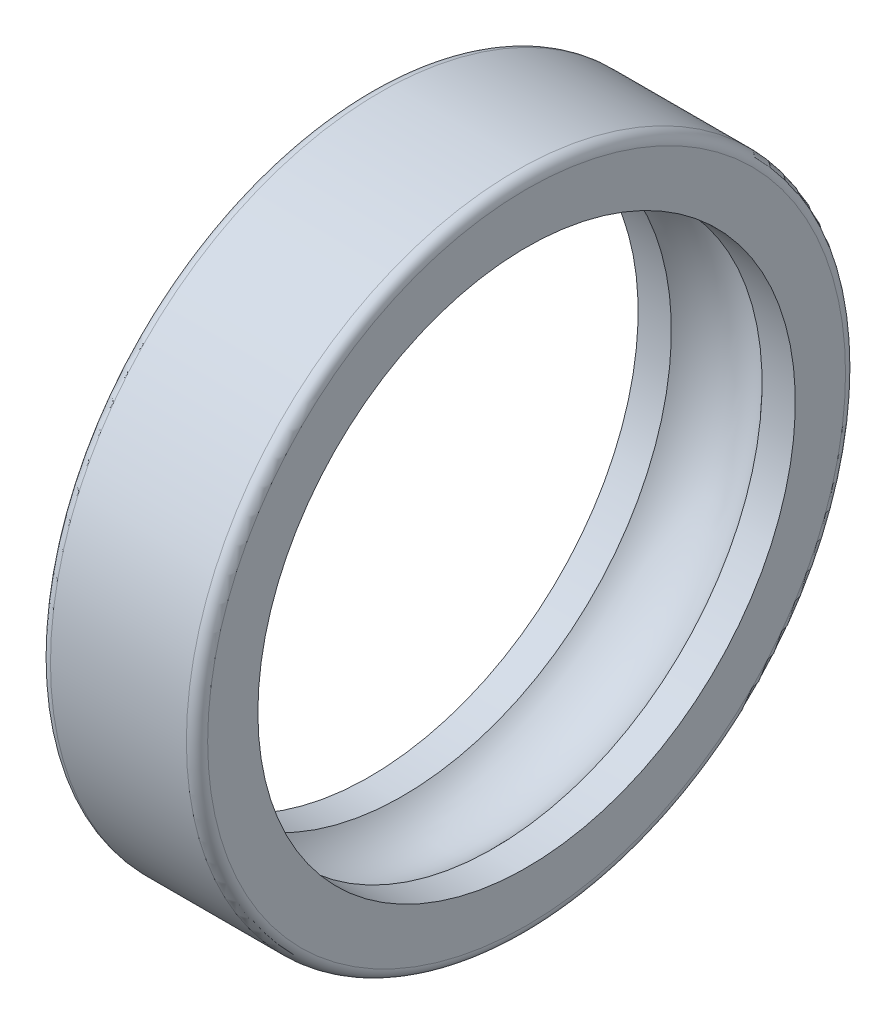
ISO-10303-21;
HEADER;
FILE_DESCRIPTION(('STEP AP214'),'2;1');
FILE_NAME('part.step','',(''),(''),'','','');
FILE_SCHEMA(('AUTOMOTIVE_DESIGN { 1 0 10303 214 1 1 1 1 }'));
ENDSEC;
DATA;
#1=APPLICATION_CONTEXT('core data for automotive mechanical design processes');
#2=APPLICATION_PROTOCOL_DEFINITION('international standard','automotive_design',2000,#1);
#3=PRODUCT_CONTEXT('',#1,'mechanical');
#4=PRODUCT('Part','Part','',(#3));
#5=PRODUCT_RELATED_PRODUCT_CATEGORY('part','',(#4));
#6=PRODUCT_DEFINITION_FORMATION('','',#4);
#7=PRODUCT_DEFINITION_CONTEXT('part definition',#1,'design');
#8=PRODUCT_DEFINITION('design','',#6,#7);
#9=PRODUCT_DEFINITION_SHAPE('','',#8);
#10=(LENGTH_UNIT() NAMED_UNIT(*) SI_UNIT(.MILLI.,.METRE.));
#11=(NAMED_UNIT(*) PLANE_ANGLE_UNIT() SI_UNIT($,.RADIAN.));
#12=(NAMED_UNIT(*) SI_UNIT($,.STERADIAN.) SOLID_ANGLE_UNIT());
#13=UNCERTAINTY_MEASURE_WITH_UNIT(LENGTH_MEASURE(1.E-05),#10,'distance_accuracy_value','');
#14=(GEOMETRIC_REPRESENTATION_CONTEXT(3) GLOBAL_UNCERTAINTY_ASSIGNED_CONTEXT((#13)) GLOBAL_UNIT_ASSIGNED_CONTEXT((#10,
#11,#12)) REPRESENTATION_CONTEXT('',''));
#15=CARTESIAN_POINT('',(0.,0.,0.));
#16=DIRECTION('',(0.,0.,1.));
#17=DIRECTION('',(1.,0.,0.));
#18=AXIS2_PLACEMENT_3D('',#15,#16,#17);
#19=CARTESIAN_POINT('',(-8.87545902678571,0.,0.));
#20=DIRECTION('',(-1.,0.,0.));
#21=DIRECTION('',(0.,0.,1.));
#22=AXIS2_PLACEMENT_3D('',#19,#20,#21);
#23=CYLINDRICAL_SURFACE('',#22,18.55);
#24=CARTESIAN_POINT('',(5.425,0.,0.));
#25=DIRECTION('',(-1.,0.,0.));
#26=DIRECTION('',(0.,0.,1.));
#27=AXIS2_PLACEMENT_3D('',#24,#25,#26);
#28=CIRCLE('',#27,18.55);
#29=CARTESIAN_POINT('',(5.425,0.,18.55));
#30=VERTEX_POINT('',#29);
#31=EDGE_CURVE('E64',#30,#30,#28,.T.);
#32=ORIENTED_EDGE('',*,*,#31,.F.);
#33=EDGE_LOOP('',(#32));
#34=FACE_BOUND('',#33,.T.);
#35=CARTESIAN_POINT('',(3.13049516849971,0.,0.));
#36=DIRECTION('',(-1.,0.,0.));
#37=DIRECTION('',(0.,0.,1.));
#38=AXIS2_PLACEMENT_3D('',#35,#36,#37);
#39=CIRCLE('',#38,18.55);
#40=CARTESIAN_POINT('',(3.13049516849971,0.,18.55));
#41=VERTEX_POINT('',#40);
#42=EDGE_CURVE('E55',#41,#41,#39,.T.);
#43=ORIENTED_EDGE('',*,*,#42,.T.);
#44=EDGE_LOOP('',(#43));
#45=FACE_BOUND('',#44,.T.);
#46=ADVANCED_FACE('F35',(#34,#45),#23,.F.);
#47=CARTESIAN_POINT('',(0.,0.,0.));
#48=DIRECTION('',(-1.,0.,0.));
#49=DIRECTION('',(0.,0.,1.));
#50=AXIS2_PLACEMENT_3D('',#47,#48,#49);
#51=TOROIDAL_SURFACE('',#50,15.75,4.2);
#52=ORIENTED_EDGE('',*,*,#42,.F.);
#53=EDGE_LOOP('',(#52));
#54=FACE_BOUND('',#53,.T.);
#55=CARTESIAN_POINT('',(-3.13049516849971,0.,0.));
#56=DIRECTION('',(-1.,0.,0.));
#57=DIRECTION('',(0.,0.,1.));
#58=AXIS2_PLACEMENT_3D('',#55,#56,#57);
#59=CIRCLE('',#58,18.55);
#60=CARTESIAN_POINT('',(-3.13049516849971,0.,18.55));
#61=VERTEX_POINT('',#60);
#62=EDGE_CURVE('E58',#61,#61,#59,.T.);
#63=ORIENTED_EDGE('',*,*,#62,.T.);
#64=EDGE_LOOP('',(#63));
#65=FACE_BOUND('',#64,.T.);
#66=ADVANCED_FACE('F72',(#54,#65),#51,.F.);
#67=CARTESIAN_POINT('',(-8.87545902678571,0.,0.));
#68=DIRECTION('',(-1.,0.,0.));
#69=DIRECTION('',(0.,0.,1.));
#70=AXIS2_PLACEMENT_3D('',#67,#68,#69);
#71=CYLINDRICAL_SURFACE('',#70,18.55);
#72=ORIENTED_EDGE('',*,*,#62,.F.);
#73=EDGE_LOOP('',(#72));
#74=FACE_BOUND('',#73,.T.);
#75=CARTESIAN_POINT('',(-5.425,0.,0.));
#76=DIRECTION('',(-1.,0.,0.));
#77=DIRECTION('',(0.,0.,1.));
#78=AXIS2_PLACEMENT_3D('',#75,#76,#77);
#79=CIRCLE('',#78,18.55);
#80=CARTESIAN_POINT('',(-5.425,0.,18.55));
#81=VERTEX_POINT('',#80);
#82=EDGE_CURVE('E61',#81,#81,#79,.T.);
#83=ORIENTED_EDGE('',*,*,#82,.T.);
#84=EDGE_LOOP('',(#83));
#85=FACE_BOUND('',#84,.T.);
#86=ADVANCED_FACE('F78',(#74,#85),#71,.F.);
#87=CARTESIAN_POINT('',(-5.425,22.75,0.));
#88=DIRECTION('',(1.,0.,0.));
#89=DIRECTION('',(0.,0.,-1.));
#90=AXIS2_PLACEMENT_3D('',#87,#88,#89);
#91=PLANE('',#90);
#92=CARTESIAN_POINT('',(-5.425,0.,0.));
#93=DIRECTION('',(1.,0.,0.));
#94=DIRECTION('',(0.,0.,-1.));
#95=AXIS2_PLACEMENT_3D('',#92,#93,#94);
#96=CIRCLE('',#95,22.015);
#97=CARTESIAN_POINT('',(-5.425,0.,-22.015));
#98=VERTEX_POINT('',#97);
#99=EDGE_CURVE('E10',#98,#98,#96,.F.);
#100=ORIENTED_EDGE('',*,*,#99,.T.);
#101=EDGE_LOOP('',(#100));
#102=FACE_BOUND('',#101,.T.);
#103=ORIENTED_EDGE('',*,*,#82,.F.);
#104=EDGE_LOOP('',(#103));
#105=FACE_BOUND('',#104,.T.);
#106=ADVANCED_FACE('F84',(#102,#105),#91,.F.);
#107=CARTESIAN_POINT('',(-8.87545902678571,0.,0.));
#108=DIRECTION('',(-1.,0.,0.));
#109=DIRECTION('',(0.,0.,1.));
#110=AXIS2_PLACEMENT_3D('',#107,#108,#109);
#111=CYLINDRICAL_SURFACE('',#110,22.75);
#112=CARTESIAN_POINT('',(4.69,0.,0.));
#113=DIRECTION('',(-1.,0.,0.));
#114=DIRECTION('',(0.,0.,1.));
#115=AXIS2_PLACEMENT_3D('',#112,#113,#114);
#116=CIRCLE('',#115,22.75);
#117=CARTESIAN_POINT('',(4.69,0.,22.75));
#118=VERTEX_POINT('',#117);
#119=EDGE_CURVE('E46',#118,#118,#116,.T.);
#120=ORIENTED_EDGE('',*,*,#119,.T.);
#121=EDGE_LOOP('',(#120));
#122=FACE_BOUND('',#121,.T.);
#123=CARTESIAN_POINT('',(-4.69,0.,0.));
#124=DIRECTION('',(1.,0.,0.));
#125=DIRECTION('',(0.,0.,-1.));
#126=AXIS2_PLACEMENT_3D('',#123,#124,#125);
#127=CIRCLE('',#126,22.75);
#128=CARTESIAN_POINT('',(-4.69,0.,-22.75));
#129=VERTEX_POINT('',#128);
#130=EDGE_CURVE('E50',#129,#129,#127,.T.);
#131=ORIENTED_EDGE('',*,*,#130,.T.);
#132=EDGE_LOOP('',(#131));
#133=FACE_BOUND('',#132,.T.);
#134=ADVANCED_FACE('F89',(#122,#133),#111,.T.);
#135=CARTESIAN_POINT('',(5.425,22.75,0.));
#136=DIRECTION('',(-1.,0.,0.));
#137=DIRECTION('',(0.,0.,1.));
#138=AXIS2_PLACEMENT_3D('',#135,#136,#137);
#139=PLANE('',#138);
#140=CARTESIAN_POINT('',(5.425,0.,0.));
#141=DIRECTION('',(-1.,0.,0.));
#142=DIRECTION('',(0.,0.,1.));
#143=AXIS2_PLACEMENT_3D('',#140,#141,#142);
#144=CIRCLE('',#143,22.015);
#145=CARTESIAN_POINT('',(5.425,0.,22.015));
#146=VERTEX_POINT('',#145);
#147=EDGE_CURVE('E42',#146,#146,#144,.F.);
#148=ORIENTED_EDGE('',*,*,#147,.T.);
#149=EDGE_LOOP('',(#148));
#150=FACE_BOUND('',#149,.T.);
#151=ORIENTED_EDGE('',*,*,#31,.T.);
#152=EDGE_LOOP('',(#151));
#153=FACE_BOUND('',#152,.T.);
#154=ADVANCED_FACE('F68',(#150,#153),#139,.F.);
#155=CARTESIAN_POINT('',(4.69,0.,0.));
#156=DIRECTION('',(-1.,0.,0.));
#157=DIRECTION('',(0.,0.,1.));
#158=AXIS2_PLACEMENT_3D('',#155,#156,#157);
#159=TOROIDAL_SURFACE('',#158,22.015,0.735);
#160=ORIENTED_EDGE('',*,*,#147,.F.);
#161=EDGE_LOOP('',(#160));
#162=FACE_BOUND('',#161,.T.);
#163=ORIENTED_EDGE('',*,*,#119,.F.);
#164=EDGE_LOOP('',(#163));
#165=FACE_BOUND('',#164,.T.);
#166=ADVANCED_FACE('F97',(#162,#165),#159,.T.);
#167=CARTESIAN_POINT('',(-4.69,0.,0.));
#168=DIRECTION('',(1.,0.,0.));
#169=DIRECTION('',(0.,0.,-1.));
#170=AXIS2_PLACEMENT_3D('',#167,#168,#169);
#171=TOROIDAL_SURFACE('',#170,22.015,0.735);
#172=ORIENTED_EDGE('',*,*,#130,.F.);
#173=EDGE_LOOP('',(#172));
#174=FACE_BOUND('',#173,.T.);
#175=ORIENTED_EDGE('',*,*,#99,.F.);
#176=EDGE_LOOP('',(#175));
#177=FACE_BOUND('',#176,.T.);
#178=ADVANCED_FACE('F37',(#174,#177),#171,.T.);
#179=CLOSED_SHELL('',(#46,#66,#86,#106,#134,#154,#166,#178));
#180=MANIFOLD_SOLID_BREP('B2',#179);
#181=ADVANCED_BREP_SHAPE_REPRESENTATION('',(#18,#180),#14);
#182=SHAPE_DEFINITION_REPRESENTATION(#9,#181);
ENDSEC;
END-ISO-10303-21;
